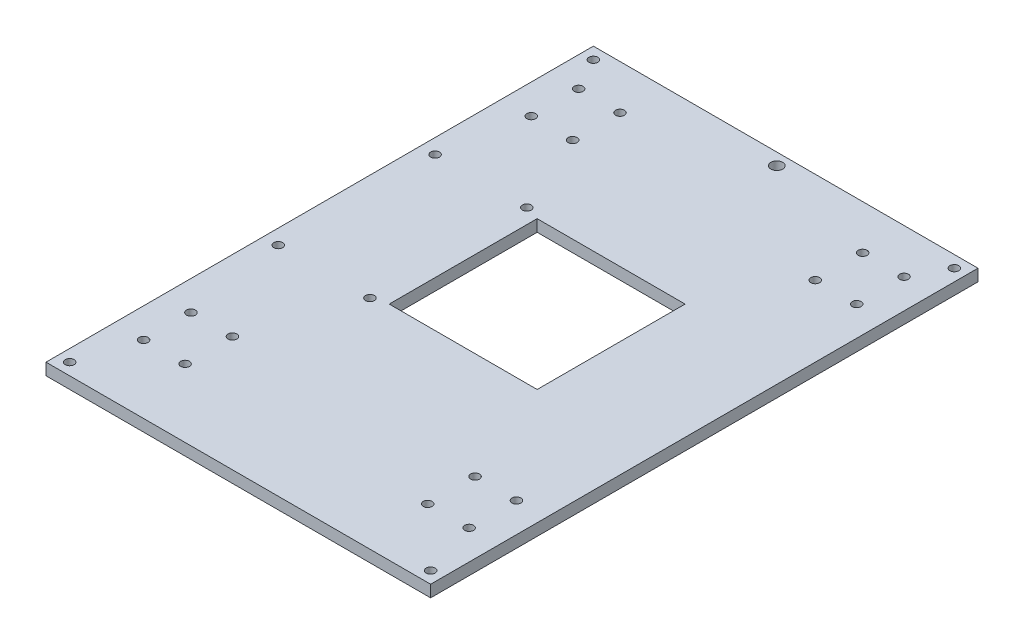
ISO-10303-21;
HEADER;
FILE_DESCRIPTION(('STEP AP214'),'2;1');
FILE_NAME('part.step','',(''),(''),'','','');
FILE_SCHEMA(('AUTOMOTIVE_DESIGN { 1 0 10303 214 1 1 1 1 }'));
ENDSEC;
DATA;
#1=APPLICATION_CONTEXT('core data for automotive mechanical design processes');
#2=APPLICATION_PROTOCOL_DEFINITION('international standard','automotive_design',2000,#1);
#3=PRODUCT_CONTEXT('',#1,'mechanical');
#4=PRODUCT('Part','Part','',(#3));
#5=PRODUCT_RELATED_PRODUCT_CATEGORY('part','',(#4));
#6=PRODUCT_DEFINITION_FORMATION('','',#4);
#7=PRODUCT_DEFINITION_CONTEXT('part definition',#1,'design');
#8=PRODUCT_DEFINITION('design','',#6,#7);
#9=PRODUCT_DEFINITION_SHAPE('','',#8);
#10=(LENGTH_UNIT() NAMED_UNIT(*) SI_UNIT(.MILLI.,.METRE.));
#11=(NAMED_UNIT(*) PLANE_ANGLE_UNIT() SI_UNIT($,.RADIAN.));
#12=(NAMED_UNIT(*) SI_UNIT($,.STERADIAN.) SOLID_ANGLE_UNIT());
#13=UNCERTAINTY_MEASURE_WITH_UNIT(LENGTH_MEASURE(1.E-05),#10,'distance_accuracy_value','');
#14=(GEOMETRIC_REPRESENTATION_CONTEXT(3) GLOBAL_UNCERTAINTY_ASSIGNED_CONTEXT((#13)) GLOBAL_UNIT_ASSIGNED_CONTEXT((#10,
#11,#12)) REPRESENTATION_CONTEXT('',''));
#15=CARTESIAN_POINT('',(0.,0.,0.));
#16=DIRECTION('',(0.,0.,1.));
#17=DIRECTION('',(1.,0.,0.));
#18=AXIS2_PLACEMENT_3D('',#15,#16,#17);
#19=CARTESIAN_POINT('',(0.,4.,0.));
#20=DIRECTION('',(0.,-1.,0.));
#21=DIRECTION('',(0.,0.,-1.));
#22=AXIS2_PLACEMENT_3D('',#19,#20,#21);
#23=PLANE('',#22);
#24=CARTESIAN_POINT('',(5.,4.,-73.5));
#25=DIRECTION('',(0.,1.,0.));
#26=DIRECTION('',(0.,0.,-1.));
#27=AXIS2_PLACEMENT_3D('',#24,#25,#26);
#28=CIRCLE('',#27,1.5);
#29=CARTESIAN_POINT('',(5.,4.,-75.));
#30=VERTEX_POINT('',#29);
#31=EDGE_CURVE('E511',#30,#30,#28,.T.);
#32=ORIENTED_EDGE('',*,*,#31,.F.);
#33=EDGE_LOOP('',(#32));
#34=FACE_BOUND('',#33,.T.);
#35=CARTESIAN_POINT('',(36.,4.,-126.5));
#36=DIRECTION('',(0.,1.,0.));
#37=DIRECTION('',(0.,0.,-1.));
#38=AXIS2_PLACEMENT_3D('',#35,#36,#37);
#39=CIRCLE('',#38,1.5);
#40=CARTESIAN_POINT('',(36.,4.,-128.));
#41=VERTEX_POINT('',#40);
#42=EDGE_CURVE('E507',#41,#41,#39,.T.);
#43=ORIENTED_EDGE('',*,*,#42,.F.);
#44=EDGE_LOOP('',(#43));
#45=FACE_BOUND('',#44,.T.);
#46=CARTESIAN_POINT('',(36.,4.,-73.5));
#47=DIRECTION('',(0.,1.,0.));
#48=DIRECTION('',(0.,0.,1.));
#49=AXIS2_PLACEMENT_3D('',#46,#47,#48);
#50=CIRCLE('',#49,1.5);
#51=CARTESIAN_POINT('',(36.,4.,-72.));
#52=VERTEX_POINT('',#51);
#53=EDGE_CURVE('E504',#52,#52,#50,.T.);
#54=ORIENTED_EDGE('',*,*,#53,.F.);
#55=EDGE_LOOP('',(#54));
#56=FACE_BOUND('',#55,.T.);
#57=CARTESIAN_POINT('',(5.,4.,-126.5));
#58=DIRECTION('',(0.,1.,0.));
#59=DIRECTION('',(0.,0.,1.));
#60=AXIS2_PLACEMENT_3D('',#57,#58,#59);
#61=CIRCLE('',#60,1.5);
#62=CARTESIAN_POINT('',(5.,4.,-125.));
#63=VERTEX_POINT('',#62);
#64=EDGE_CURVE('E350',#63,#63,#61,.T.);
#65=ORIENTED_EDGE('',*,*,#64,.F.);
#66=EDGE_LOOP('',(#65));
#67=FACE_BOUND('',#66,.T.);
#68=CARTESIAN_POINT('',(66.,4.,-181.));
#69=DIRECTION('',(0.,1.,0.));
#70=DIRECTION('',(0.,0.,-1.));
#71=AXIS2_PLACEMENT_3D('',#68,#69,#70);
#72=CIRCLE('',#71,2.);
#73=CARTESIAN_POINT('',(66.,4.,-183.));
#74=VERTEX_POINT('',#73);
#75=EDGE_CURVE('E344',#74,#74,#72,.T.);
#76=ORIENTED_EDGE('',*,*,#75,.F.);
#77=EDGE_LOOP('',(#76));
#78=FACE_BOUND('',#77,.T.);
#79=CARTESIAN_POINT('',(4.,4.,-181.));
#80=DIRECTION('',(0.,1.,0.));
#81=DIRECTION('',(0.,0.,1.));
#82=AXIS2_PLACEMENT_3D('',#79,#80,#81);
#83=CIRCLE('',#82,1.5);
#84=CARTESIAN_POINT('',(4.,4.,-179.5));
#85=VERTEX_POINT('',#84);
#86=EDGE_CURVE('E374',#85,#85,#83,.T.);
#87=ORIENTED_EDGE('',*,*,#86,.F.);
#88=EDGE_LOOP('',(#87));
#89=FACE_BOUND('',#88,.T.);
#90=CARTESIAN_POINT('',(126.,4.,-4.));
#91=DIRECTION('',(0.,1.,0.));
#92=DIRECTION('',(0.,0.,1.));
#93=AXIS2_PLACEMENT_3D('',#90,#91,#92);
#94=CIRCLE('',#93,1.5);
#95=CARTESIAN_POINT('',(126.,4.,-2.5));
#96=VERTEX_POINT('',#95);
#97=EDGE_CURVE('E135',#96,#96,#94,.T.);
#98=ORIENTED_EDGE('',*,*,#97,.F.);
#99=EDGE_LOOP('',(#98));
#100=FACE_BOUND('',#99,.T.);
#101=DIRECTION('',(-1.,0.,0.));
#102=VECTOR('',#101,1.);
#103=CARTESIAN_POINT('',(41.,4.,-125.));
#104=LINE('',#103,#102);
#105=CARTESIAN_POINT('',(91.,4.,-125.));
#106=VERTEX_POINT('',#105);
#107=CARTESIAN_POINT('',(41.,4.,-125.));
#108=VERTEX_POINT('',#107);
#109=EDGE_CURVE('E144',#106,#108,#104,.T.);
#110=ORIENTED_EDGE('',*,*,#109,.F.);
#111=DIRECTION('',(0.,0.,-1.));
#112=VECTOR('',#111,1.);
#113=CARTESIAN_POINT('',(91.,4.,-125.));
#114=LINE('',#113,#112);
#115=CARTESIAN_POINT('',(91.,4.,-75.));
#116=VERTEX_POINT('',#115);
#117=EDGE_CURVE('E57',#116,#106,#114,.T.);
#118=ORIENTED_EDGE('',*,*,#117,.F.);
#119=DIRECTION('',(1.,0.,0.));
#120=VECTOR('',#119,1.);
#121=CARTESIAN_POINT('',(41.,4.,-75.));
#122=LINE('',#121,#120);
#123=CARTESIAN_POINT('',(41.,4.,-75.));
#124=VERTEX_POINT('',#123);
#125=EDGE_CURVE('E128',#124,#116,#122,.T.);
#126=ORIENTED_EDGE('',*,*,#125,.F.);
#127=DIRECTION('',(0.,0.,1.));
#128=VECTOR('',#127,1.);
#129=CARTESIAN_POINT('',(41.,4.,-125.));
#130=LINE('',#129,#128);
#131=EDGE_CURVE('E132',#108,#124,#130,.T.);
#132=ORIENTED_EDGE('',*,*,#131,.F.);
#133=EDGE_LOOP('',(#110,#118,#126,#132));
#134=FACE_BOUND('',#133,.T.);
#135=DIRECTION('',(0.,0.,1.));
#136=VECTOR('',#135,1.);
#137=CARTESIAN_POINT('',(0.,4.,0.));
#138=LINE('',#137,#136);
#139=CARTESIAN_POINT('',(0.,4.,-185.));
#140=VERTEX_POINT('',#139);
#141=CARTESIAN_POINT('',(0.,4.,0.));
#142=VERTEX_POINT('',#141);
#143=EDGE_CURVE('E288',#140,#142,#138,.T.);
#144=ORIENTED_EDGE('',*,*,#143,.T.);
#145=DIRECTION('',(1.,0.,0.));
#146=VECTOR('',#145,1.);
#147=CARTESIAN_POINT('',(0.,4.,0.));
#148=LINE('',#147,#146);
#149=CARTESIAN_POINT('',(130.,4.,0.));
#150=VERTEX_POINT('',#149);
#151=EDGE_CURVE('E292',#142,#150,#148,.T.);
#152=ORIENTED_EDGE('',*,*,#151,.T.);
#153=DIRECTION('',(0.,0.,-1.));
#154=VECTOR('',#153,1.);
#155=CARTESIAN_POINT('',(130.,4.,0.));
#156=LINE('',#155,#154);
#157=CARTESIAN_POINT('',(130.,4.,-185.));
#158=VERTEX_POINT('',#157);
#159=EDGE_CURVE('E296',#150,#158,#156,.T.);
#160=ORIENTED_EDGE('',*,*,#159,.T.);
#161=DIRECTION('',(-1.,0.,0.));
#162=VECTOR('',#161,1.);
#163=CARTESIAN_POINT('',(0.,4.,-185.));
#164=LINE('',#163,#162);
#165=EDGE_CURVE('E299',#158,#140,#164,.T.);
#166=ORIENTED_EDGE('',*,*,#165,.T.);
#167=EDGE_LOOP('',(#144,#152,#160,#166));
#168=FACE_BOUND('',#167,.T.);
#169=CARTESIAN_POINT('',(10.,4.,-39.));
#170=DIRECTION('',(0.,1.,0.));
#171=DIRECTION('',(0.,0.,1.));
#172=AXIS2_PLACEMENT_3D('',#169,#170,#171);
#173=CIRCLE('',#172,1.5);
#174=CARTESIAN_POINT('',(10.,4.,-37.5));
#175=VERTEX_POINT('',#174);
#176=EDGE_CURVE('E280',#175,#175,#173,.T.);
#177=ORIENTED_EDGE('',*,*,#176,.F.);
#178=EDGE_LOOP('',(#177));
#179=FACE_BOUND('',#178,.T.);
#180=CARTESIAN_POINT('',(24.,4.,-39.));
#181=DIRECTION('',(0.,1.,0.));
#182=DIRECTION('',(0.,0.,1.));
#183=AXIS2_PLACEMENT_3D('',#180,#181,#182);
#184=CIRCLE('',#183,1.5);
#185=CARTESIAN_POINT('',(24.,4.,-37.5));
#186=VERTEX_POINT('',#185);
#187=EDGE_CURVE('E272',#186,#186,#184,.T.);
#188=ORIENTED_EDGE('',*,*,#187,.F.);
#189=EDGE_LOOP('',(#188));
#190=FACE_BOUND('',#189,.T.);
#191=CARTESIAN_POINT('',(10.,4.,-23.));
#192=DIRECTION('',(0.,1.,0.));
#193=DIRECTION('',(0.,0.,1.));
#194=AXIS2_PLACEMENT_3D('',#191,#192,#193);
#195=CIRCLE('',#194,1.5);
#196=CARTESIAN_POINT('',(10.,4.,-21.5));
#197=VERTEX_POINT('',#196);
#198=EDGE_CURVE('E264',#197,#197,#195,.T.);
#199=ORIENTED_EDGE('',*,*,#198,.F.);
#200=EDGE_LOOP('',(#199));
#201=FACE_BOUND('',#200,.T.);
#202=CARTESIAN_POINT('',(24.,4.,-23.));
#203=DIRECTION('',(0.,1.,0.));
#204=DIRECTION('',(0.,0.,1.));
#205=AXIS2_PLACEMENT_3D('',#202,#203,#204);
#206=CIRCLE('',#205,1.5);
#207=CARTESIAN_POINT('',(24.,4.,-21.5));
#208=VERTEX_POINT('',#207);
#209=EDGE_CURVE('E256',#208,#208,#206,.T.);
#210=ORIENTED_EDGE('',*,*,#209,.F.);
#211=EDGE_LOOP('',(#210));
#212=FACE_BOUND('',#211,.T.);
#213=CARTESIAN_POINT('',(120.,4.,-23.));
#214=DIRECTION('',(0.,1.,0.));
#215=DIRECTION('',(0.,0.,-1.));
#216=AXIS2_PLACEMENT_3D('',#213,#214,#215);
#217=CIRCLE('',#216,1.5);
#218=CARTESIAN_POINT('',(120.,4.,-24.5));
#219=VERTEX_POINT('',#218);
#220=EDGE_CURVE('E248',#219,#219,#217,.T.);
#221=ORIENTED_EDGE('',*,*,#220,.F.);
#222=EDGE_LOOP('',(#221));
#223=FACE_BOUND('',#222,.T.);
#224=CARTESIAN_POINT('',(120.,4.,-39.));
#225=DIRECTION('',(0.,1.,0.));
#226=DIRECTION('',(0.,0.,-1.));
#227=AXIS2_PLACEMENT_3D('',#224,#225,#226);
#228=CIRCLE('',#227,1.5);
#229=CARTESIAN_POINT('',(120.,4.,-40.5));
#230=VERTEX_POINT('',#229);
#231=EDGE_CURVE('E240',#230,#230,#228,.T.);
#232=ORIENTED_EDGE('',*,*,#231,.F.);
#233=EDGE_LOOP('',(#232));
#234=FACE_BOUND('',#233,.T.);
#235=CARTESIAN_POINT('',(106.,4.,-39.));
#236=DIRECTION('',(0.,1.,0.));
#237=DIRECTION('',(0.,0.,-1.));
#238=AXIS2_PLACEMENT_3D('',#235,#236,#237);
#239=CIRCLE('',#238,1.50000000000001);
#240=CARTESIAN_POINT('',(106.,4.,-40.5));
#241=VERTEX_POINT('',#240);
#242=EDGE_CURVE('E232',#241,#241,#239,.T.);
#243=ORIENTED_EDGE('',*,*,#242,.F.);
#244=EDGE_LOOP('',(#243));
#245=FACE_BOUND('',#244,.T.);
#246=CARTESIAN_POINT('',(106.,4.,-23.));
#247=DIRECTION('',(0.,1.,0.));
#248=DIRECTION('',(0.,0.,-1.));
#249=AXIS2_PLACEMENT_3D('',#246,#247,#248);
#250=CIRCLE('',#249,1.5);
#251=CARTESIAN_POINT('',(106.,4.,-24.5));
#252=VERTEX_POINT('',#251);
#253=EDGE_CURVE('E224',#252,#252,#250,.T.);
#254=ORIENTED_EDGE('',*,*,#253,.F.);
#255=EDGE_LOOP('',(#254));
#256=FACE_BOUND('',#255,.T.);
#257=CARTESIAN_POINT('',(106.,4.,-170.));
#258=DIRECTION('',(0.,1.,0.));
#259=DIRECTION('',(0.,0.,1.));
#260=AXIS2_PLACEMENT_3D('',#257,#258,#259);
#261=CIRCLE('',#260,1.5);
#262=CARTESIAN_POINT('',(106.,4.,-168.5));
#263=VERTEX_POINT('',#262);
#264=EDGE_CURVE('E216',#263,#263,#261,.T.);
#265=ORIENTED_EDGE('',*,*,#264,.F.);
#266=EDGE_LOOP('',(#265));
#267=FACE_BOUND('',#266,.T.);
#268=CARTESIAN_POINT('',(120.,4.,-170.));
#269=DIRECTION('',(0.,1.,0.));
#270=DIRECTION('',(0.,0.,1.));
#271=AXIS2_PLACEMENT_3D('',#268,#269,#270);
#272=CIRCLE('',#271,1.5);
#273=CARTESIAN_POINT('',(120.,4.,-168.5));
#274=VERTEX_POINT('',#273);
#275=EDGE_CURVE('E208',#274,#274,#272,.T.);
#276=ORIENTED_EDGE('',*,*,#275,.F.);
#277=EDGE_LOOP('',(#276));
#278=FACE_BOUND('',#277,.T.);
#279=CARTESIAN_POINT('',(106.,4.,-154.));
#280=DIRECTION('',(0.,1.,0.));
#281=DIRECTION('',(0.,0.,1.));
#282=AXIS2_PLACEMENT_3D('',#279,#280,#281);
#283=CIRCLE('',#282,1.50000000000001);
#284=CARTESIAN_POINT('',(106.,4.,-152.5));
#285=VERTEX_POINT('',#284);
#286=EDGE_CURVE('E200',#285,#285,#283,.T.);
#287=ORIENTED_EDGE('',*,*,#286,.F.);
#288=EDGE_LOOP('',(#287));
#289=FACE_BOUND('',#288,.T.);
#290=CARTESIAN_POINT('',(120.,4.,-154.));
#291=DIRECTION('',(0.,1.,0.));
#292=DIRECTION('',(0.,0.,1.));
#293=AXIS2_PLACEMENT_3D('',#290,#291,#292);
#294=CIRCLE('',#293,1.5);
#295=CARTESIAN_POINT('',(120.,4.,-152.5));
#296=VERTEX_POINT('',#295);
#297=EDGE_CURVE('E192',#296,#296,#294,.T.);
#298=ORIENTED_EDGE('',*,*,#297,.F.);
#299=EDGE_LOOP('',(#298));
#300=FACE_BOUND('',#299,.T.);
#301=CARTESIAN_POINT('',(24.,4.,-154.));
#302=DIRECTION('',(0.,1.,0.));
#303=DIRECTION('',(0.,0.,-1.));
#304=AXIS2_PLACEMENT_3D('',#301,#302,#303);
#305=CIRCLE('',#304,1.5);
#306=CARTESIAN_POINT('',(24.,4.,-155.5));
#307=VERTEX_POINT('',#306);
#308=EDGE_CURVE('E184',#307,#307,#305,.T.);
#309=ORIENTED_EDGE('',*,*,#308,.F.);
#310=EDGE_LOOP('',(#309));
#311=FACE_BOUND('',#310,.T.);
#312=CARTESIAN_POINT('',(24.,4.,-170.));
#313=DIRECTION('',(0.,1.,0.));
#314=DIRECTION('',(0.,0.,-1.));
#315=AXIS2_PLACEMENT_3D('',#312,#313,#314);
#316=CIRCLE('',#315,1.5);
#317=CARTESIAN_POINT('',(24.,4.,-171.5));
#318=VERTEX_POINT('',#317);
#319=EDGE_CURVE('E176',#318,#318,#316,.T.);
#320=ORIENTED_EDGE('',*,*,#319,.F.);
#321=EDGE_LOOP('',(#320));
#322=FACE_BOUND('',#321,.T.);
#323=CARTESIAN_POINT('',(10.,4.,-170.));
#324=DIRECTION('',(0.,1.,0.));
#325=DIRECTION('',(0.,0.,-1.));
#326=AXIS2_PLACEMENT_3D('',#323,#324,#325);
#327=CIRCLE('',#326,1.5);
#328=CARTESIAN_POINT('',(10.,4.,-171.5));
#329=VERTEX_POINT('',#328);
#330=EDGE_CURVE('E168',#329,#329,#327,.T.);
#331=ORIENTED_EDGE('',*,*,#330,.F.);
#332=EDGE_LOOP('',(#331));
#333=FACE_BOUND('',#332,.T.);
#334=CARTESIAN_POINT('',(10.,4.,-154.));
#335=DIRECTION('',(0.,1.,0.));
#336=DIRECTION('',(0.,0.,-1.));
#337=AXIS2_PLACEMENT_3D('',#334,#335,#336);
#338=CIRCLE('',#337,1.5);
#339=CARTESIAN_POINT('',(10.,4.,-155.5));
#340=VERTEX_POINT('',#339);
#341=EDGE_CURVE('E160',#340,#340,#338,.T.);
#342=ORIENTED_EDGE('',*,*,#341,.F.);
#343=EDGE_LOOP('',(#342));
#344=FACE_BOUND('',#343,.T.);
#345=CARTESIAN_POINT('',(4.,4.,-4.));
#346=DIRECTION('',(0.,-1.,0.));
#347=DIRECTION('',(0.,0.,-1.));
#348=AXIS2_PLACEMENT_3D('',#345,#346,#347);
#349=CIRCLE('',#348,1.5);
#350=CARTESIAN_POINT('',(4.,4.,-5.5));
#351=VERTEX_POINT('',#350);
#352=EDGE_CURVE('E370',#351,#351,#349,.T.);
#353=ORIENTED_EDGE('',*,*,#352,.T.);
#354=EDGE_LOOP('',(#353));
#355=FACE_BOUND('',#354,.T.);
#356=CARTESIAN_POINT('',(126.,4.,-181.));
#357=DIRECTION('',(0.,-1.,0.));
#358=DIRECTION('',(0.,0.,-1.));
#359=AXIS2_PLACEMENT_3D('',#356,#357,#358);
#360=CIRCLE('',#359,1.5);
#361=CARTESIAN_POINT('',(126.,4.,-182.5));
#362=VERTEX_POINT('',#361);
#363=EDGE_CURVE('E343',#362,#362,#360,.T.);
#364=ORIENTED_EDGE('',*,*,#363,.T.);
#365=EDGE_LOOP('',(#364));
#366=FACE_BOUND('',#365,.T.);
#367=ADVANCED_FACE('F39',(#34,#45,#56,#67,#78,#89,#100,#134,#168,#179,#190,#201,#212,#223,#234,
#245,#256,#267,#278,#289,#300,#311,#322,#333,#344,#355,#366),#23,.F.);
#368=CARTESIAN_POINT('',(0.,0.,0.));
#369=DIRECTION('',(0.,-1.,0.));
#370=DIRECTION('',(0.,0.,-1.));
#371=AXIS2_PLACEMENT_3D('',#368,#369,#370);
#372=PLANE('',#371);
#373=CARTESIAN_POINT('',(5.,0.,-73.5));
#374=DIRECTION('',(0.,-1.,0.));
#375=DIRECTION('',(0.,0.,-1.));
#376=AXIS2_PLACEMENT_3D('',#373,#374,#375);
#377=CIRCLE('',#376,1.5);
#378=CARTESIAN_POINT('',(5.,0.,-75.));
#379=VERTEX_POINT('',#378);
#380=EDGE_CURVE('E43',#379,#379,#377,.T.);
#381=ORIENTED_EDGE('',*,*,#380,.F.);
#382=EDGE_LOOP('',(#381));
#383=FACE_BOUND('',#382,.T.);
#384=CARTESIAN_POINT('',(36.,0.,-126.5));
#385=DIRECTION('',(0.,-1.,0.));
#386=DIRECTION('',(0.,0.,-1.));
#387=AXIS2_PLACEMENT_3D('',#384,#385,#386);
#388=CIRCLE('',#387,1.5);
#389=CARTESIAN_POINT('',(36.,0.,-128.));
#390=VERTEX_POINT('',#389);
#391=EDGE_CURVE('E353',#390,#390,#388,.T.);
#392=ORIENTED_EDGE('',*,*,#391,.F.);
#393=EDGE_LOOP('',(#392));
#394=FACE_BOUND('',#393,.T.);
#395=CARTESIAN_POINT('',(36.,0.,-73.5));
#396=DIRECTION('',(0.,-1.,0.));
#397=DIRECTION('',(0.,0.,-1.));
#398=AXIS2_PLACEMENT_3D('',#395,#396,#397);
#399=CIRCLE('',#398,1.5);
#400=CARTESIAN_POINT('',(36.,0.,-75.));
#401=VERTEX_POINT('',#400);
#402=EDGE_CURVE('E349',#401,#401,#399,.T.);
#403=ORIENTED_EDGE('',*,*,#402,.F.);
#404=EDGE_LOOP('',(#403));
#405=FACE_BOUND('',#404,.T.);
#406=CARTESIAN_POINT('',(5.,0.,-126.5));
#407=DIRECTION('',(0.,-1.,0.));
#408=DIRECTION('',(0.,0.,-1.));
#409=AXIS2_PLACEMENT_3D('',#406,#407,#408);
#410=CIRCLE('',#409,1.5);
#411=CARTESIAN_POINT('',(5.,0.,-128.));
#412=VERTEX_POINT('',#411);
#413=EDGE_CURVE('E345',#412,#412,#410,.T.);
#414=ORIENTED_EDGE('',*,*,#413,.F.);
#415=EDGE_LOOP('',(#414));
#416=FACE_BOUND('',#415,.T.);
#417=CARTESIAN_POINT('',(66.,0.,-181.));
#418=DIRECTION('',(0.,-1.,0.));
#419=DIRECTION('',(0.,0.,-1.));
#420=AXIS2_PLACEMENT_3D('',#417,#418,#419);
#421=CIRCLE('',#420,2.);
#422=CARTESIAN_POINT('',(66.,0.,-183.));
#423=VERTEX_POINT('',#422);
#424=EDGE_CURVE('E339',#423,#423,#421,.T.);
#425=ORIENTED_EDGE('',*,*,#424,.F.);
#426=EDGE_LOOP('',(#425));
#427=FACE_BOUND('',#426,.T.);
#428=CARTESIAN_POINT('',(4.,0.,-4.));
#429=DIRECTION('',(0.,-1.,0.));
#430=DIRECTION('',(0.,0.,-1.));
#431=AXIS2_PLACEMENT_3D('',#428,#429,#430);
#432=CIRCLE('',#431,1.5);
#433=CARTESIAN_POINT('',(4.,0.,-5.5));
#434=VERTEX_POINT('',#433);
#435=EDGE_CURVE('E328',#434,#434,#432,.F.);
#436=ORIENTED_EDGE('',*,*,#435,.T.);
#437=EDGE_LOOP('',(#436));
#438=FACE_BOUND('',#437,.T.);
#439=CARTESIAN_POINT('',(126.,0.,-4.));
#440=DIRECTION('',(0.,-1.,0.));
#441=DIRECTION('',(0.,0.,-1.));
#442=AXIS2_PLACEMENT_3D('',#439,#440,#441);
#443=CIRCLE('',#442,1.5);
#444=CARTESIAN_POINT('',(126.,0.,-5.5));
#445=VERTEX_POINT('',#444);
#446=EDGE_CURVE('E324',#445,#445,#443,.T.);
#447=ORIENTED_EDGE('',*,*,#446,.F.);
#448=EDGE_LOOP('',(#447));
#449=FACE_BOUND('',#448,.T.);
#450=DIRECTION('',(0.,0.,-1.));
#451=VECTOR('',#450,1.);
#452=CARTESIAN_POINT('',(91.,0.,-125.));
#453=LINE('',#452,#451);
#454=CARTESIAN_POINT('',(91.,0.,-75.));
#455=VERTEX_POINT('',#454);
#456=CARTESIAN_POINT('',(91.,0.,-125.));
#457=VERTEX_POINT('',#456);
#458=EDGE_CURVE('E109',#455,#457,#453,.T.);
#459=ORIENTED_EDGE('',*,*,#458,.T.);
#460=DIRECTION('',(-1.,0.,0.));
#461=VECTOR('',#460,1.);
#462=CARTESIAN_POINT('',(41.,0.,-125.));
#463=LINE('',#462,#461);
#464=CARTESIAN_POINT('',(41.,0.,-125.));
#465=VERTEX_POINT('',#464);
#466=EDGE_CURVE('E119',#457,#465,#463,.T.);
#467=ORIENTED_EDGE('',*,*,#466,.T.);
#468=DIRECTION('',(0.,0.,1.));
#469=VECTOR('',#468,1.);
#470=CARTESIAN_POINT('',(41.,0.,-125.));
#471=LINE('',#470,#469);
#472=CARTESIAN_POINT('',(41.,0.,-75.));
#473=VERTEX_POINT('',#472);
#474=EDGE_CURVE('E65',#465,#473,#471,.T.);
#475=ORIENTED_EDGE('',*,*,#474,.T.);
#476=DIRECTION('',(1.,0.,0.));
#477=VECTOR('',#476,1.);
#478=CARTESIAN_POINT('',(41.,0.,-75.));
#479=LINE('',#478,#477);
#480=EDGE_CURVE('E116',#473,#455,#479,.T.);
#481=ORIENTED_EDGE('',*,*,#480,.T.);
#482=EDGE_LOOP('',(#459,#467,#475,#481));
#483=FACE_BOUND('',#482,.T.);
#484=CARTESIAN_POINT('',(10.,0.,-170.));
#485=DIRECTION('',(0.,1.,0.));
#486=DIRECTION('',(0.,0.,-1.));
#487=AXIS2_PLACEMENT_3D('',#484,#485,#486);
#488=CIRCLE('',#487,1.5);
#489=CARTESIAN_POINT('',(10.,0.,-171.5));
#490=VERTEX_POINT('',#489);
#491=EDGE_CURVE('E164',#490,#490,#488,.T.);
#492=ORIENTED_EDGE('',*,*,#491,.T.);
#493=EDGE_LOOP('',(#492));
#494=FACE_BOUND('',#493,.T.);
#495=CARTESIAN_POINT('',(24.,0.,-154.));
#496=DIRECTION('',(0.,1.,0.));
#497=DIRECTION('',(0.,0.,-1.));
#498=AXIS2_PLACEMENT_3D('',#495,#496,#497);
#499=CIRCLE('',#498,1.5);
#500=CARTESIAN_POINT('',(24.,0.,-155.5));
#501=VERTEX_POINT('',#500);
#502=EDGE_CURVE('E180',#501,#501,#499,.T.);
#503=ORIENTED_EDGE('',*,*,#502,.T.);
#504=EDGE_LOOP('',(#503));
#505=FACE_BOUND('',#504,.T.);
#506=CARTESIAN_POINT('',(106.,0.,-154.));
#507=DIRECTION('',(0.,1.,0.));
#508=DIRECTION('',(0.,0.,1.));
#509=AXIS2_PLACEMENT_3D('',#506,#507,#508);
#510=CIRCLE('',#509,1.50000000000001);
#511=CARTESIAN_POINT('',(106.,0.,-152.5));
#512=VERTEX_POINT('',#511);
#513=EDGE_CURVE('E196',#512,#512,#510,.T.);
#514=ORIENTED_EDGE('',*,*,#513,.T.);
#515=EDGE_LOOP('',(#514));
#516=FACE_BOUND('',#515,.T.);
#517=CARTESIAN_POINT('',(106.,0.,-170.));
#518=DIRECTION('',(0.,1.,0.));
#519=DIRECTION('',(0.,0.,1.));
#520=AXIS2_PLACEMENT_3D('',#517,#518,#519);
#521=CIRCLE('',#520,1.5);
#522=CARTESIAN_POINT('',(106.,0.,-168.5));
#523=VERTEX_POINT('',#522);
#524=EDGE_CURVE('E212',#523,#523,#521,.T.);
#525=ORIENTED_EDGE('',*,*,#524,.T.);
#526=EDGE_LOOP('',(#525));
#527=FACE_BOUND('',#526,.T.);
#528=CARTESIAN_POINT('',(106.,0.,-39.));
#529=DIRECTION('',(0.,1.,0.));
#530=DIRECTION('',(0.,0.,-1.));
#531=AXIS2_PLACEMENT_3D('',#528,#529,#530);
#532=CIRCLE('',#531,1.50000000000001);
#533=CARTESIAN_POINT('',(106.,0.,-40.5));
#534=VERTEX_POINT('',#533);
#535=EDGE_CURVE('E228',#534,#534,#532,.T.);
#536=ORIENTED_EDGE('',*,*,#535,.T.);
#537=EDGE_LOOP('',(#536));
#538=FACE_BOUND('',#537,.T.);
#539=CARTESIAN_POINT('',(120.,0.,-23.));
#540=DIRECTION('',(0.,1.,0.));
#541=DIRECTION('',(0.,0.,-1.));
#542=AXIS2_PLACEMENT_3D('',#539,#540,#541);
#543=CIRCLE('',#542,1.5);
#544=CARTESIAN_POINT('',(120.,0.,-24.5));
#545=VERTEX_POINT('',#544);
#546=EDGE_CURVE('E244',#545,#545,#543,.T.);
#547=ORIENTED_EDGE('',*,*,#546,.T.);
#548=EDGE_LOOP('',(#547));
#549=FACE_BOUND('',#548,.T.);
#550=CARTESIAN_POINT('',(10.,0.,-23.));
#551=DIRECTION('',(0.,1.,0.));
#552=DIRECTION('',(0.,0.,1.));
#553=AXIS2_PLACEMENT_3D('',#550,#551,#552);
#554=CIRCLE('',#553,1.5);
#555=CARTESIAN_POINT('',(10.,0.,-21.5));
#556=VERTEX_POINT('',#555);
#557=EDGE_CURVE('E260',#556,#556,#554,.T.);
#558=ORIENTED_EDGE('',*,*,#557,.T.);
#559=EDGE_LOOP('',(#558));
#560=FACE_BOUND('',#559,.T.);
#561=CARTESIAN_POINT('',(10.,0.,-39.));
#562=DIRECTION('',(0.,1.,0.));
#563=DIRECTION('',(0.,0.,1.));
#564=AXIS2_PLACEMENT_3D('',#561,#562,#563);
#565=CIRCLE('',#564,1.5);
#566=CARTESIAN_POINT('',(10.,0.,-37.5));
#567=VERTEX_POINT('',#566);
#568=EDGE_CURVE('E276',#567,#567,#565,.T.);
#569=ORIENTED_EDGE('',*,*,#568,.T.);
#570=EDGE_LOOP('',(#569));
#571=FACE_BOUND('',#570,.T.);
#572=DIRECTION('',(0.,0.,1.));
#573=VECTOR('',#572,1.);
#574=CARTESIAN_POINT('',(0.,0.,0.));
#575=LINE('',#574,#573);
#576=CARTESIAN_POINT('',(0.,0.,-185.));
#577=VERTEX_POINT('',#576);
#578=CARTESIAN_POINT('',(0.,0.,0.));
#579=VERTEX_POINT('',#578);
#580=EDGE_CURVE('E284',#577,#579,#575,.T.);
#581=ORIENTED_EDGE('',*,*,#580,.F.);
#582=DIRECTION('',(-1.,0.,0.));
#583=VECTOR('',#582,1.);
#584=CARTESIAN_POINT('',(0.,0.,-185.));
#585=LINE('',#584,#583);
#586=CARTESIAN_POINT('',(130.,0.,-185.));
#587=VERTEX_POINT('',#586);
#588=EDGE_CURVE('E293',#587,#577,#585,.T.);
#589=ORIENTED_EDGE('',*,*,#588,.F.);
#590=DIRECTION('',(0.,0.,-1.));
#591=VECTOR('',#590,1.);
#592=CARTESIAN_POINT('',(130.,0.,0.));
#593=LINE('',#592,#591);
#594=CARTESIAN_POINT('',(130.,0.,0.));
#595=VERTEX_POINT('',#594);
#596=EDGE_CURVE('E309',#595,#587,#593,.T.);
#597=ORIENTED_EDGE('',*,*,#596,.F.);
#598=DIRECTION('',(1.,0.,0.));
#599=VECTOR('',#598,1.);
#600=CARTESIAN_POINT('',(0.,0.,0.));
#601=LINE('',#600,#599);
#602=EDGE_CURVE('E306',#579,#595,#601,.T.);
#603=ORIENTED_EDGE('',*,*,#602,.F.);
#604=EDGE_LOOP('',(#581,#589,#597,#603));
#605=FACE_BOUND('',#604,.T.);
#606=CARTESIAN_POINT('',(24.,0.,-39.));
#607=DIRECTION('',(0.,1.,0.));
#608=DIRECTION('',(0.,0.,1.));
#609=AXIS2_PLACEMENT_3D('',#606,#607,#608);
#610=CIRCLE('',#609,1.5);
#611=CARTESIAN_POINT('',(24.,0.,-37.5));
#612=VERTEX_POINT('',#611);
#613=EDGE_CURVE('E268',#612,#612,#610,.T.);
#614=ORIENTED_EDGE('',*,*,#613,.T.);
#615=EDGE_LOOP('',(#614));
#616=FACE_BOUND('',#615,.T.);
#617=CARTESIAN_POINT('',(24.,0.,-23.));
#618=DIRECTION('',(0.,1.,0.));
#619=DIRECTION('',(0.,0.,1.));
#620=AXIS2_PLACEMENT_3D('',#617,#618,#619);
#621=CIRCLE('',#620,1.5);
#622=CARTESIAN_POINT('',(24.,0.,-21.5));
#623=VERTEX_POINT('',#622);
#624=EDGE_CURVE('E252',#623,#623,#621,.T.);
#625=ORIENTED_EDGE('',*,*,#624,.T.);
#626=EDGE_LOOP('',(#625));
#627=FACE_BOUND('',#626,.T.);
#628=CARTESIAN_POINT('',(120.,0.,-39.));
#629=DIRECTION('',(0.,1.,0.));
#630=DIRECTION('',(0.,0.,-1.));
#631=AXIS2_PLACEMENT_3D('',#628,#629,#630);
#632=CIRCLE('',#631,1.5);
#633=CARTESIAN_POINT('',(120.,0.,-40.5));
#634=VERTEX_POINT('',#633);
#635=EDGE_CURVE('E236',#634,#634,#632,.T.);
#636=ORIENTED_EDGE('',*,*,#635,.T.);
#637=EDGE_LOOP('',(#636));
#638=FACE_BOUND('',#637,.T.);
#639=CARTESIAN_POINT('',(106.,0.,-23.));
#640=DIRECTION('',(0.,1.,0.));
#641=DIRECTION('',(0.,0.,-1.));
#642=AXIS2_PLACEMENT_3D('',#639,#640,#641);
#643=CIRCLE('',#642,1.5);
#644=CARTESIAN_POINT('',(106.,0.,-24.5));
#645=VERTEX_POINT('',#644);
#646=EDGE_CURVE('E220',#645,#645,#643,.T.);
#647=ORIENTED_EDGE('',*,*,#646,.T.);
#648=EDGE_LOOP('',(#647));
#649=FACE_BOUND('',#648,.T.);
#650=CARTESIAN_POINT('',(120.,0.,-170.));
#651=DIRECTION('',(0.,1.,0.));
#652=DIRECTION('',(0.,0.,1.));
#653=AXIS2_PLACEMENT_3D('',#650,#651,#652);
#654=CIRCLE('',#653,1.5);
#655=CARTESIAN_POINT('',(120.,0.,-168.5));
#656=VERTEX_POINT('',#655);
#657=EDGE_CURVE('E204',#656,#656,#654,.T.);
#658=ORIENTED_EDGE('',*,*,#657,.T.);
#659=EDGE_LOOP('',(#658));
#660=FACE_BOUND('',#659,.T.);
#661=CARTESIAN_POINT('',(120.,0.,-154.));
#662=DIRECTION('',(0.,1.,0.));
#663=DIRECTION('',(0.,0.,1.));
#664=AXIS2_PLACEMENT_3D('',#661,#662,#663);
#665=CIRCLE('',#664,1.5);
#666=CARTESIAN_POINT('',(120.,0.,-152.5));
#667=VERTEX_POINT('',#666);
#668=EDGE_CURVE('E188',#667,#667,#665,.T.);
#669=ORIENTED_EDGE('',*,*,#668,.T.);
#670=EDGE_LOOP('',(#669));
#671=FACE_BOUND('',#670,.T.);
#672=CARTESIAN_POINT('',(24.,0.,-170.));
#673=DIRECTION('',(0.,1.,0.));
#674=DIRECTION('',(0.,0.,-1.));
#675=AXIS2_PLACEMENT_3D('',#672,#673,#674);
#676=CIRCLE('',#675,1.5);
#677=CARTESIAN_POINT('',(24.,0.,-171.5));
#678=VERTEX_POINT('',#677);
#679=EDGE_CURVE('E172',#678,#678,#676,.T.);
#680=ORIENTED_EDGE('',*,*,#679,.T.);
#681=EDGE_LOOP('',(#680));
#682=FACE_BOUND('',#681,.T.);
#683=CARTESIAN_POINT('',(10.,0.,-154.));
#684=DIRECTION('',(0.,1.,0.));
#685=DIRECTION('',(0.,0.,-1.));
#686=AXIS2_PLACEMENT_3D('',#683,#684,#685);
#687=CIRCLE('',#686,1.5);
#688=CARTESIAN_POINT('',(10.,0.,-155.5));
#689=VERTEX_POINT('',#688);
#690=EDGE_CURVE('E154',#689,#689,#687,.T.);
#691=ORIENTED_EDGE('',*,*,#690,.T.);
#692=EDGE_LOOP('',(#691));
#693=FACE_BOUND('',#692,.T.);
#694=CARTESIAN_POINT('',(4.,0.,-181.));
#695=DIRECTION('',(0.,-1.,0.));
#696=DIRECTION('',(0.,0.,-1.));
#697=AXIS2_PLACEMENT_3D('',#694,#695,#696);
#698=CIRCLE('',#697,1.5);
#699=CARTESIAN_POINT('',(4.,0.,-182.5));
#700=VERTEX_POINT('',#699);
#701=EDGE_CURVE('E332',#700,#700,#698,.T.);
#702=ORIENTED_EDGE('',*,*,#701,.F.);
#703=EDGE_LOOP('',(#702));
#704=FACE_BOUND('',#703,.T.);
#705=CARTESIAN_POINT('',(126.,0.,-181.));
#706=DIRECTION('',(0.,-1.,0.));
#707=DIRECTION('',(0.,0.,-1.));
#708=AXIS2_PLACEMENT_3D('',#705,#706,#707);
#709=CIRCLE('',#708,1.5);
#710=CARTESIAN_POINT('',(126.,0.,-182.5));
#711=VERTEX_POINT('',#710);
#712=EDGE_CURVE('E145',#711,#711,#709,.F.);
#713=ORIENTED_EDGE('',*,*,#712,.T.);
#714=EDGE_LOOP('',(#713));
#715=FACE_BOUND('',#714,.T.);
#716=ADVANCED_FACE('F124',(#383,#394,#405,#416,#427,#438,#449,#483,#494,#505,#516,#527,#538,
#549,#560,#571,#605,#616,#627,#638,#649,#660,#671,#682,#693,#704,#715),#372,.T.);
#717=CARTESIAN_POINT('',(0.,4.,0.));
#718=DIRECTION('',(1.,0.,0.));
#719=DIRECTION('',(0.,0.,-1.));
#720=AXIS2_PLACEMENT_3D('',#717,#718,#719);
#721=PLANE('',#720);
#722=ORIENTED_EDGE('',*,*,#580,.T.);
#723=DIRECTION('',(0.,-1.,0.));
#724=VECTOR('',#723,1.);
#725=CARTESIAN_POINT('',(0.,4.,0.));
#726=LINE('',#725,#724);
#727=EDGE_CURVE('E11',#142,#579,#726,.T.);
#728=ORIENTED_EDGE('',*,*,#727,.F.);
#729=ORIENTED_EDGE('',*,*,#143,.F.);
#730=DIRECTION('',(0.,-1.,0.));
#731=VECTOR('',#730,1.);
#732=CARTESIAN_POINT('',(0.,4.,-185.));
#733=LINE('',#732,#731);
#734=EDGE_CURVE('E302',#140,#577,#733,.T.);
#735=ORIENTED_EDGE('',*,*,#734,.T.);
#736=EDGE_LOOP('',(#722,#728,#729,#735));
#737=FACE_BOUND('',#736,.T.);
#738=ADVANCED_FACE('F41',(#737),#721,.F.);
#739=CARTESIAN_POINT('',(0.,4.,0.));
#740=DIRECTION('',(0.,0.,-1.));
#741=DIRECTION('',(-1.,0.,0.));
#742=AXIS2_PLACEMENT_3D('',#739,#740,#741);
#743=PLANE('',#742);
#744=ORIENTED_EDGE('',*,*,#602,.T.);
#745=DIRECTION('',(0.,-1.,0.));
#746=VECTOR('',#745,1.);
#747=CARTESIAN_POINT('',(130.,4.,0.));
#748=LINE('',#747,#746);
#749=EDGE_CURVE('E49',#150,#595,#748,.T.);
#750=ORIENTED_EDGE('',*,*,#749,.F.);
#751=ORIENTED_EDGE('',*,*,#151,.F.);
#752=ORIENTED_EDGE('',*,*,#727,.T.);
#753=EDGE_LOOP('',(#744,#750,#751,#752));
#754=FACE_BOUND('',#753,.T.);
#755=ADVANCED_FACE('F420',(#754),#743,.F.);
#756=CARTESIAN_POINT('',(130.,4.,0.));
#757=DIRECTION('',(-1.,0.,0.));
#758=DIRECTION('',(0.,0.,1.));
#759=AXIS2_PLACEMENT_3D('',#756,#757,#758);
#760=PLANE('',#759);
#761=ORIENTED_EDGE('',*,*,#596,.T.);
#762=DIRECTION('',(0.,-1.,0.));
#763=VECTOR('',#762,1.);
#764=CARTESIAN_POINT('',(130.,4.,-185.));
#765=LINE('',#764,#763);
#766=EDGE_CURVE('E317',#158,#587,#765,.T.);
#767=ORIENTED_EDGE('',*,*,#766,.F.);
#768=ORIENTED_EDGE('',*,*,#159,.F.);
#769=ORIENTED_EDGE('',*,*,#749,.T.);
#770=EDGE_LOOP('',(#761,#767,#768,#769));
#771=FACE_BOUND('',#770,.T.);
#772=ADVANCED_FACE('F417',(#771),#760,.F.);
#773=CARTESIAN_POINT('',(0.,4.,-185.));
#774=DIRECTION('',(0.,0.,1.));
#775=DIRECTION('',(1.,0.,0.));
#776=AXIS2_PLACEMENT_3D('',#773,#774,#775);
#777=PLANE('',#776);
#778=ORIENTED_EDGE('',*,*,#588,.T.);
#779=ORIENTED_EDGE('',*,*,#734,.F.);
#780=ORIENTED_EDGE('',*,*,#165,.F.);
#781=ORIENTED_EDGE('',*,*,#766,.T.);
#782=EDGE_LOOP('',(#778,#779,#780,#781));
#783=FACE_BOUND('',#782,.T.);
#784=ADVANCED_FACE('F414',(#783),#777,.F.);
#785=CARTESIAN_POINT('',(10.,4.,-39.));
#786=DIRECTION('',(0.,-1.,0.));
#787=DIRECTION('',(0.,0.,-1.));
#788=AXIS2_PLACEMENT_3D('',#785,#786,#787);
#789=CYLINDRICAL_SURFACE('',#788,1.5);
#790=ORIENTED_EDGE('',*,*,#176,.T.);
#791=EDGE_LOOP('',(#790));
#792=FACE_BOUND('',#791,.T.);
#793=ORIENTED_EDGE('',*,*,#568,.F.);
#794=EDGE_LOOP('',(#793));
#795=FACE_BOUND('',#794,.T.);
#796=ADVANCED_FACE('F411',(#792,#795),#789,.F.);
#797=CARTESIAN_POINT('',(24.,4.,-39.));
#798=DIRECTION('',(0.,-1.,0.));
#799=DIRECTION('',(0.,0.,-1.));
#800=AXIS2_PLACEMENT_3D('',#797,#798,#799);
#801=CYLINDRICAL_SURFACE('',#800,1.5);
#802=ORIENTED_EDGE('',*,*,#187,.T.);
#803=EDGE_LOOP('',(#802));
#804=FACE_BOUND('',#803,.T.);
#805=ORIENTED_EDGE('',*,*,#613,.F.);
#806=EDGE_LOOP('',(#805));
#807=FACE_BOUND('',#806,.T.);
#808=ADVANCED_FACE('F598',(#804,#807),#801,.F.);
#809=CARTESIAN_POINT('',(10.,4.,-23.));
#810=DIRECTION('',(0.,-1.,0.));
#811=DIRECTION('',(0.,0.,-1.));
#812=AXIS2_PLACEMENT_3D('',#809,#810,#811);
#813=CYLINDRICAL_SURFACE('',#812,1.5);
#814=ORIENTED_EDGE('',*,*,#198,.T.);
#815=EDGE_LOOP('',(#814));
#816=FACE_BOUND('',#815,.T.);
#817=ORIENTED_EDGE('',*,*,#557,.F.);
#818=EDGE_LOOP('',(#817));
#819=FACE_BOUND('',#818,.T.);
#820=ADVANCED_FACE('F595',(#816,#819),#813,.F.);
#821=CARTESIAN_POINT('',(24.,4.,-23.));
#822=DIRECTION('',(0.,-1.,0.));
#823=DIRECTION('',(0.,0.,-1.));
#824=AXIS2_PLACEMENT_3D('',#821,#822,#823);
#825=CYLINDRICAL_SURFACE('',#824,1.5);
#826=ORIENTED_EDGE('',*,*,#209,.T.);
#827=EDGE_LOOP('',(#826));
#828=FACE_BOUND('',#827,.T.);
#829=ORIENTED_EDGE('',*,*,#624,.F.);
#830=EDGE_LOOP('',(#829));
#831=FACE_BOUND('',#830,.T.);
#832=ADVANCED_FACE('F591',(#828,#831),#825,.F.);
#833=CARTESIAN_POINT('',(120.,4.,-23.));
#834=DIRECTION('',(0.,-1.,0.));
#835=DIRECTION('',(0.,0.,-1.));
#836=AXIS2_PLACEMENT_3D('',#833,#834,#835);
#837=CYLINDRICAL_SURFACE('',#836,1.5);
#838=ORIENTED_EDGE('',*,*,#220,.T.);
#839=EDGE_LOOP('',(#838));
#840=FACE_BOUND('',#839,.T.);
#841=ORIENTED_EDGE('',*,*,#546,.F.);
#842=EDGE_LOOP('',(#841));
#843=FACE_BOUND('',#842,.T.);
#844=ADVANCED_FACE('F587',(#840,#843),#837,.F.);
#845=CARTESIAN_POINT('',(120.,4.,-39.));
#846=DIRECTION('',(0.,-1.,0.));
#847=DIRECTION('',(0.,0.,-1.));
#848=AXIS2_PLACEMENT_3D('',#845,#846,#847);
#849=CYLINDRICAL_SURFACE('',#848,1.5);
#850=ORIENTED_EDGE('',*,*,#231,.T.);
#851=EDGE_LOOP('',(#850));
#852=FACE_BOUND('',#851,.T.);
#853=ORIENTED_EDGE('',*,*,#635,.F.);
#854=EDGE_LOOP('',(#853));
#855=FACE_BOUND('',#854,.T.);
#856=ADVANCED_FACE('F583',(#852,#855),#849,.F.);
#857=CARTESIAN_POINT('',(106.,4.,-39.));
#858=DIRECTION('',(0.,-1.,0.));
#859=DIRECTION('',(0.,0.,-1.));
#860=AXIS2_PLACEMENT_3D('',#857,#858,#859);
#861=CYLINDRICAL_SURFACE('',#860,1.50000000000001);
#862=ORIENTED_EDGE('',*,*,#242,.T.);
#863=EDGE_LOOP('',(#862));
#864=FACE_BOUND('',#863,.T.);
#865=ORIENTED_EDGE('',*,*,#535,.F.);
#866=EDGE_LOOP('',(#865));
#867=FACE_BOUND('',#866,.T.);
#868=ADVANCED_FACE('F579',(#864,#867),#861,.F.);
#869=CARTESIAN_POINT('',(106.,4.,-23.));
#870=DIRECTION('',(0.,-1.,0.));
#871=DIRECTION('',(0.,0.,-1.));
#872=AXIS2_PLACEMENT_3D('',#869,#870,#871);
#873=CYLINDRICAL_SURFACE('',#872,1.5);
#874=ORIENTED_EDGE('',*,*,#253,.T.);
#875=EDGE_LOOP('',(#874));
#876=FACE_BOUND('',#875,.T.);
#877=ORIENTED_EDGE('',*,*,#646,.F.);
#878=EDGE_LOOP('',(#877));
#879=FACE_BOUND('',#878,.T.);
#880=ADVANCED_FACE('F575',(#876,#879),#873,.F.);
#881=CARTESIAN_POINT('',(106.,4.,-170.));
#882=DIRECTION('',(0.,-1.,0.));
#883=DIRECTION('',(0.,0.,-1.));
#884=AXIS2_PLACEMENT_3D('',#881,#882,#883);
#885=CYLINDRICAL_SURFACE('',#884,1.5);
#886=ORIENTED_EDGE('',*,*,#264,.T.);
#887=EDGE_LOOP('',(#886));
#888=FACE_BOUND('',#887,.T.);
#889=ORIENTED_EDGE('',*,*,#524,.F.);
#890=EDGE_LOOP('',(#889));
#891=FACE_BOUND('',#890,.T.);
#892=ADVANCED_FACE('F571',(#888,#891),#885,.F.);
#893=CARTESIAN_POINT('',(120.,4.,-170.));
#894=DIRECTION('',(0.,-1.,0.));
#895=DIRECTION('',(0.,0.,-1.));
#896=AXIS2_PLACEMENT_3D('',#893,#894,#895);
#897=CYLINDRICAL_SURFACE('',#896,1.5);
#898=ORIENTED_EDGE('',*,*,#275,.T.);
#899=EDGE_LOOP('',(#898));
#900=FACE_BOUND('',#899,.T.);
#901=ORIENTED_EDGE('',*,*,#657,.F.);
#902=EDGE_LOOP('',(#901));
#903=FACE_BOUND('',#902,.T.);
#904=ADVANCED_FACE('F567',(#900,#903),#897,.F.);
#905=CARTESIAN_POINT('',(106.,4.,-154.));
#906=DIRECTION('',(0.,-1.,0.));
#907=DIRECTION('',(0.,0.,-1.));
#908=AXIS2_PLACEMENT_3D('',#905,#906,#907);
#909=CYLINDRICAL_SURFACE('',#908,1.50000000000001);
#910=ORIENTED_EDGE('',*,*,#286,.T.);
#911=EDGE_LOOP('',(#910));
#912=FACE_BOUND('',#911,.T.);
#913=ORIENTED_EDGE('',*,*,#513,.F.);
#914=EDGE_LOOP('',(#913));
#915=FACE_BOUND('',#914,.T.);
#916=ADVANCED_FACE('F563',(#912,#915),#909,.F.);
#917=CARTESIAN_POINT('',(120.,4.,-154.));
#918=DIRECTION('',(0.,-1.,0.));
#919=DIRECTION('',(0.,0.,-1.));
#920=AXIS2_PLACEMENT_3D('',#917,#918,#919);
#921=CYLINDRICAL_SURFACE('',#920,1.5);
#922=ORIENTED_EDGE('',*,*,#297,.T.);
#923=EDGE_LOOP('',(#922));
#924=FACE_BOUND('',#923,.T.);
#925=ORIENTED_EDGE('',*,*,#668,.F.);
#926=EDGE_LOOP('',(#925));
#927=FACE_BOUND('',#926,.T.);
#928=ADVANCED_FACE('F559',(#924,#927),#921,.F.);
#929=CARTESIAN_POINT('',(24.,4.,-154.));
#930=DIRECTION('',(0.,-1.,0.));
#931=DIRECTION('',(0.,0.,-1.));
#932=AXIS2_PLACEMENT_3D('',#929,#930,#931);
#933=CYLINDRICAL_SURFACE('',#932,1.5);
#934=ORIENTED_EDGE('',*,*,#308,.T.);
#935=EDGE_LOOP('',(#934));
#936=FACE_BOUND('',#935,.T.);
#937=ORIENTED_EDGE('',*,*,#502,.F.);
#938=EDGE_LOOP('',(#937));
#939=FACE_BOUND('',#938,.T.);
#940=ADVANCED_FACE('F555',(#936,#939),#933,.F.);
#941=CARTESIAN_POINT('',(24.,4.,-170.));
#942=DIRECTION('',(0.,-1.,0.));
#943=DIRECTION('',(0.,0.,-1.));
#944=AXIS2_PLACEMENT_3D('',#941,#942,#943);
#945=CYLINDRICAL_SURFACE('',#944,1.5);
#946=ORIENTED_EDGE('',*,*,#319,.T.);
#947=EDGE_LOOP('',(#946));
#948=FACE_BOUND('',#947,.T.);
#949=ORIENTED_EDGE('',*,*,#679,.F.);
#950=EDGE_LOOP('',(#949));
#951=FACE_BOUND('',#950,.T.);
#952=ADVANCED_FACE('F551',(#948,#951),#945,.F.);
#953=CARTESIAN_POINT('',(10.,4.,-170.));
#954=DIRECTION('',(0.,-1.,0.));
#955=DIRECTION('',(0.,0.,-1.));
#956=AXIS2_PLACEMENT_3D('',#953,#954,#955);
#957=CYLINDRICAL_SURFACE('',#956,1.5);
#958=ORIENTED_EDGE('',*,*,#330,.T.);
#959=EDGE_LOOP('',(#958));
#960=FACE_BOUND('',#959,.T.);
#961=ORIENTED_EDGE('',*,*,#491,.F.);
#962=EDGE_LOOP('',(#961));
#963=FACE_BOUND('',#962,.T.);
#964=ADVANCED_FACE('F547',(#960,#963),#957,.F.);
#965=CARTESIAN_POINT('',(10.,4.,-154.));
#966=DIRECTION('',(0.,-1.,0.));
#967=DIRECTION('',(0.,0.,-1.));
#968=AXIS2_PLACEMENT_3D('',#965,#966,#967);
#969=CYLINDRICAL_SURFACE('',#968,1.5);
#970=ORIENTED_EDGE('',*,*,#341,.T.);
#971=EDGE_LOOP('',(#970));
#972=FACE_BOUND('',#971,.T.);
#973=ORIENTED_EDGE('',*,*,#690,.F.);
#974=EDGE_LOOP('',(#973));
#975=FACE_BOUND('',#974,.T.);
#976=ADVANCED_FACE('F540',(#972,#975),#969,.F.);
#977=CARTESIAN_POINT('',(91.,0.,-125.));
#978=DIRECTION('',(1.,0.,0.));
#979=DIRECTION('',(0.,0.,-1.));
#980=AXIS2_PLACEMENT_3D('',#977,#978,#979);
#981=PLANE('',#980);
#982=ORIENTED_EDGE('',*,*,#117,.T.);
#983=DIRECTION('',(0.,1.,0.));
#984=VECTOR('',#983,1.);
#985=CARTESIAN_POINT('',(91.,0.,-125.));
#986=LINE('',#985,#984);
#987=EDGE_CURVE('E105',#457,#106,#986,.T.);
#988=ORIENTED_EDGE('',*,*,#987,.F.);
#989=ORIENTED_EDGE('',*,*,#458,.F.);
#990=DIRECTION('',(0.,1.,0.));
#991=VECTOR('',#990,1.);
#992=CARTESIAN_POINT('',(91.,0.,-75.));
#993=LINE('',#992,#991);
#994=EDGE_CURVE('E151',#455,#116,#993,.T.);
#995=ORIENTED_EDGE('',*,*,#994,.T.);
#996=EDGE_LOOP('',(#982,#988,#989,#995));
#997=FACE_BOUND('',#996,.T.);
#998=ADVANCED_FACE('F107',(#997),#981,.F.);
#999=CARTESIAN_POINT('',(41.,0.,-75.));
#1000=DIRECTION('',(0.,0.,1.));
#1001=DIRECTION('',(1.,0.,0.));
#1002=AXIS2_PLACEMENT_3D('',#999,#1000,#1001);
#1003=PLANE('',#1002);
#1004=ORIENTED_EDGE('',*,*,#125,.T.);
#1005=ORIENTED_EDGE('',*,*,#994,.F.);
#1006=ORIENTED_EDGE('',*,*,#480,.F.);
#1007=DIRECTION('',(0.,1.,0.));
#1008=VECTOR('',#1007,1.);
#1009=CARTESIAN_POINT('',(41.,0.,-75.));
#1010=LINE('',#1009,#1008);
#1011=EDGE_CURVE('E155',#473,#124,#1010,.T.);
#1012=ORIENTED_EDGE('',*,*,#1011,.T.);
#1013=EDGE_LOOP('',(#1004,#1005,#1006,#1012));
#1014=FACE_BOUND('',#1013,.T.);
#1015=ADVANCED_FACE('F532',(#1014),#1003,.F.);
#1016=CARTESIAN_POINT('',(41.,0.,-125.));
#1017=DIRECTION('',(-1.,0.,0.));
#1018=DIRECTION('',(0.,0.,1.));
#1019=AXIS2_PLACEMENT_3D('',#1016,#1017,#1018);
#1020=PLANE('',#1019);
#1021=ORIENTED_EDGE('',*,*,#131,.T.);
#1022=ORIENTED_EDGE('',*,*,#1011,.F.);
#1023=ORIENTED_EDGE('',*,*,#474,.F.);
#1024=DIRECTION('',(0.,1.,0.));
#1025=VECTOR('',#1024,1.);
#1026=CARTESIAN_POINT('',(41.,0.,-125.));
#1027=LINE('',#1026,#1025);
#1028=EDGE_CURVE('E115',#465,#108,#1027,.T.);
#1029=ORIENTED_EDGE('',*,*,#1028,.T.);
#1030=EDGE_LOOP('',(#1021,#1022,#1023,#1029));
#1031=FACE_BOUND('',#1030,.T.);
#1032=ADVANCED_FACE('F530',(#1031),#1020,.F.);
#1033=CARTESIAN_POINT('',(41.,0.,-125.));
#1034=DIRECTION('',(0.,0.,-1.));
#1035=DIRECTION('',(-1.,0.,0.));
#1036=AXIS2_PLACEMENT_3D('',#1033,#1034,#1035);
#1037=PLANE('',#1036);
#1038=ORIENTED_EDGE('',*,*,#109,.T.);
#1039=ORIENTED_EDGE('',*,*,#1028,.F.);
#1040=ORIENTED_EDGE('',*,*,#466,.F.);
#1041=ORIENTED_EDGE('',*,*,#987,.T.);
#1042=EDGE_LOOP('',(#1038,#1039,#1040,#1041));
#1043=FACE_BOUND('',#1042,.T.);
#1044=ADVANCED_FACE('F120',(#1043),#1037,.F.);
#1045=CARTESIAN_POINT('',(126.,-45.5,-4.));
#1046=DIRECTION('',(0.,1.,0.));
#1047=DIRECTION('',(0.,0.,1.));
#1048=AXIS2_PLACEMENT_3D('',#1045,#1046,#1047);
#1049=CYLINDRICAL_SURFACE('',#1048,1.5);
#1050=ORIENTED_EDGE('',*,*,#446,.T.);
#1051=EDGE_LOOP('',(#1050));
#1052=FACE_BOUND('',#1051,.T.);
#1053=ORIENTED_EDGE('',*,*,#97,.T.);
#1054=EDGE_LOOP('',(#1053));
#1055=FACE_BOUND('',#1054,.T.);
#1056=ADVANCED_FACE('F477',(#1052,#1055),#1049,.F.);
#1057=CARTESIAN_POINT('',(4.,-45.5,-4.));
#1058=DIRECTION('',(0.,1.,0.));
#1059=DIRECTION('',(0.,0.,1.));
#1060=AXIS2_PLACEMENT_3D('',#1057,#1058,#1059);
#1061=CYLINDRICAL_SURFACE('',#1060,1.5);
#1062=ORIENTED_EDGE('',*,*,#435,.F.);
#1063=EDGE_LOOP('',(#1062));
#1064=FACE_BOUND('',#1063,.T.);
#1065=ORIENTED_EDGE('',*,*,#352,.F.);
#1066=EDGE_LOOP('',(#1065));
#1067=FACE_BOUND('',#1066,.T.);
#1068=ADVANCED_FACE('F395',(#1064,#1067),#1061,.F.);
#1069=CARTESIAN_POINT('',(4.,-45.5,-181.));
#1070=DIRECTION('',(0.,1.,0.));
#1071=DIRECTION('',(0.,0.,1.));
#1072=AXIS2_PLACEMENT_3D('',#1069,#1070,#1071);
#1073=CYLINDRICAL_SURFACE('',#1072,1.5);
#1074=ORIENTED_EDGE('',*,*,#701,.T.);
#1075=EDGE_LOOP('',(#1074));
#1076=FACE_BOUND('',#1075,.T.);
#1077=ORIENTED_EDGE('',*,*,#86,.T.);
#1078=EDGE_LOOP('',(#1077));
#1079=FACE_BOUND('',#1078,.T.);
#1080=ADVANCED_FACE('F385',(#1076,#1079),#1073,.F.);
#1081=CARTESIAN_POINT('',(126.,-45.5,-181.));
#1082=DIRECTION('',(0.,1.,0.));
#1083=DIRECTION('',(0.,0.,1.));
#1084=AXIS2_PLACEMENT_3D('',#1081,#1082,#1083);
#1085=CYLINDRICAL_SURFACE('',#1084,1.5);
#1086=ORIENTED_EDGE('',*,*,#712,.F.);
#1087=EDGE_LOOP('',(#1086));
#1088=FACE_BOUND('',#1087,.T.);
#1089=ORIENTED_EDGE('',*,*,#363,.F.);
#1090=EDGE_LOOP('',(#1089));
#1091=FACE_BOUND('',#1090,.T.);
#1092=ADVANCED_FACE('F382',(#1088,#1091),#1085,.F.);
#1093=CARTESIAN_POINT('',(66.,-45.5,-181.));
#1094=DIRECTION('',(0.,1.,0.));
#1095=DIRECTION('',(0.,0.,1.));
#1096=AXIS2_PLACEMENT_3D('',#1093,#1094,#1095);
#1097=CYLINDRICAL_SURFACE('',#1096,2.);
#1098=ORIENTED_EDGE('',*,*,#424,.T.);
#1099=EDGE_LOOP('',(#1098));
#1100=FACE_BOUND('',#1099,.T.);
#1101=ORIENTED_EDGE('',*,*,#75,.T.);
#1102=EDGE_LOOP('',(#1101));
#1103=FACE_BOUND('',#1102,.T.);
#1104=ADVANCED_FACE('F384',(#1100,#1103),#1097,.F.);
#1105=CARTESIAN_POINT('',(5.,-6.,-126.5));
#1106=DIRECTION('',(0.,1.,0.));
#1107=DIRECTION('',(0.,0.,1.));
#1108=AXIS2_PLACEMENT_3D('',#1105,#1106,#1107);
#1109=CYLINDRICAL_SURFACE('',#1108,1.5);
#1110=ORIENTED_EDGE('',*,*,#413,.T.);
#1111=EDGE_LOOP('',(#1110));
#1112=FACE_BOUND('',#1111,.T.);
#1113=ORIENTED_EDGE('',*,*,#64,.T.);
#1114=EDGE_LOOP('',(#1113));
#1115=FACE_BOUND('',#1114,.T.);
#1116=ADVANCED_FACE('F392',(#1112,#1115),#1109,.F.);
#1117=CARTESIAN_POINT('',(36.,-6.,-73.5));
#1118=DIRECTION('',(0.,1.,0.));
#1119=DIRECTION('',(0.,0.,1.));
#1120=AXIS2_PLACEMENT_3D('',#1117,#1118,#1119);
#1121=CYLINDRICAL_SURFACE('',#1120,1.5);
#1122=ORIENTED_EDGE('',*,*,#402,.T.);
#1123=EDGE_LOOP('',(#1122));
#1124=FACE_BOUND('',#1123,.T.);
#1125=ORIENTED_EDGE('',*,*,#53,.T.);
#1126=EDGE_LOOP('',(#1125));
#1127=FACE_BOUND('',#1126,.T.);
#1128=ADVANCED_FACE('F488',(#1124,#1127),#1121,.F.);
#1129=CARTESIAN_POINT('',(36.,-6.,-126.5));
#1130=DIRECTION('',(0.,1.,0.));
#1131=DIRECTION('',(0.,0.,1.));
#1132=AXIS2_PLACEMENT_3D('',#1129,#1130,#1131);
#1133=CYLINDRICAL_SURFACE('',#1132,1.5);
#1134=ORIENTED_EDGE('',*,*,#391,.T.);
#1135=EDGE_LOOP('',(#1134));
#1136=FACE_BOUND('',#1135,.T.);
#1137=ORIENTED_EDGE('',*,*,#42,.T.);
#1138=EDGE_LOOP('',(#1137));
#1139=FACE_BOUND('',#1138,.T.);
#1140=ADVANCED_FACE('F490',(#1136,#1139),#1133,.F.);
#1141=CARTESIAN_POINT('',(5.,-6.,-73.5));
#1142=DIRECTION('',(0.,1.,0.));
#1143=DIRECTION('',(0.,0.,1.));
#1144=AXIS2_PLACEMENT_3D('',#1141,#1142,#1143);
#1145=CYLINDRICAL_SURFACE('',#1144,1.5);
#1146=ORIENTED_EDGE('',*,*,#380,.T.);
#1147=EDGE_LOOP('',(#1146));
#1148=FACE_BOUND('',#1147,.T.);
#1149=ORIENTED_EDGE('',*,*,#31,.T.);
#1150=EDGE_LOOP('',(#1149));
#1151=FACE_BOUND('',#1150,.T.);
#1152=ADVANCED_FACE('F493',(#1148,#1151),#1145,.F.);
#1153=CLOSED_SHELL('',(#367,#716,#738,#755,#772,#784,#796,#808,#820,#832,#844,#856,#868,#880,
#892,#904,#916,#928,#940,#952,#964,#976,#998,#1015,#1032,#1044,#1056,#1068,#1080,#1092,#1104,
#1116,#1128,#1140,#1152));
#1154=MANIFOLD_SOLID_BREP('B2',#1153);
#1155=ADVANCED_BREP_SHAPE_REPRESENTATION('',(#18,#1154),#14);
#1156=SHAPE_DEFINITION_REPRESENTATION(#9,#1155);
ENDSEC;
END-ISO-10303-21;
